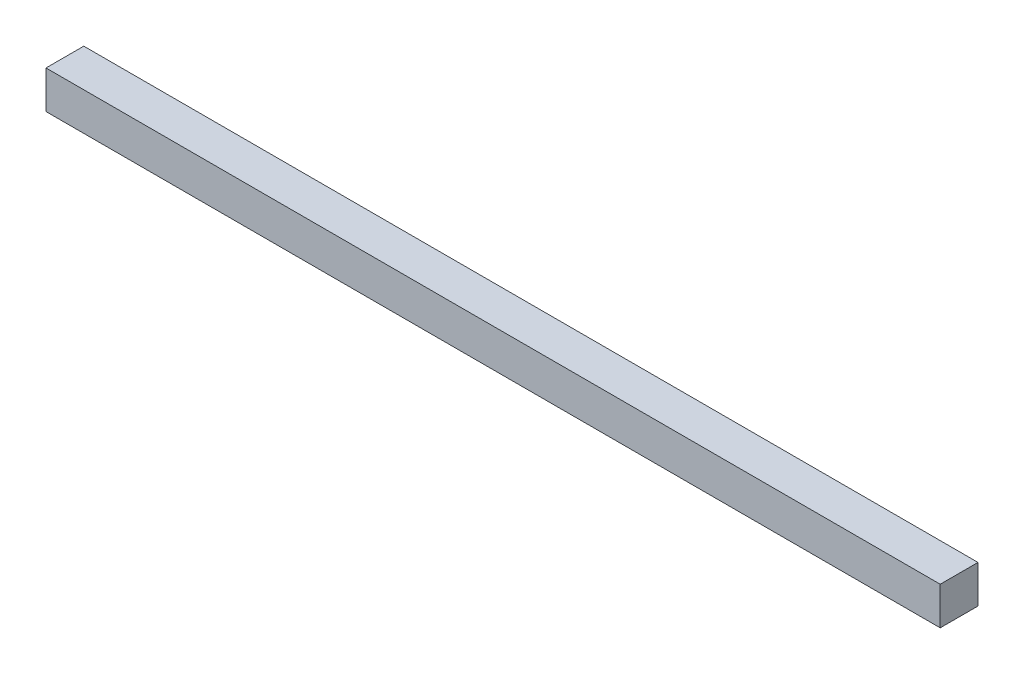
ISO-10303-21;
HEADER;
FILE_DESCRIPTION(('STEP AP214'),'2;1');
FILE_NAME('part.step','',(''),(''),'','','');
FILE_SCHEMA(('AUTOMOTIVE_DESIGN { 1 0 10303 214 1 1 1 1 }'));
ENDSEC;
DATA;
#1=APPLICATION_CONTEXT('core data for automotive mechanical design processes');
#2=APPLICATION_PROTOCOL_DEFINITION('international standard','automotive_design',2000,#1);
#3=PRODUCT_CONTEXT('',#1,'mechanical');
#4=PRODUCT('Part','Part','',(#3));
#5=PRODUCT_RELATED_PRODUCT_CATEGORY('part','',(#4));
#6=PRODUCT_DEFINITION_FORMATION('','',#4);
#7=PRODUCT_DEFINITION_CONTEXT('part definition',#1,'design');
#8=PRODUCT_DEFINITION('design','',#6,#7);
#9=PRODUCT_DEFINITION_SHAPE('','',#8);
#10=(LENGTH_UNIT() NAMED_UNIT(*) SI_UNIT(.MILLI.,.METRE.));
#11=(NAMED_UNIT(*) PLANE_ANGLE_UNIT() SI_UNIT($,.RADIAN.));
#12=(NAMED_UNIT(*) SI_UNIT($,.STERADIAN.) SOLID_ANGLE_UNIT());
#13=UNCERTAINTY_MEASURE_WITH_UNIT(LENGTH_MEASURE(1.E-05),#10,'distance_accuracy_value','');
#14=(GEOMETRIC_REPRESENTATION_CONTEXT(3) GLOBAL_UNCERTAINTY_ASSIGNED_CONTEXT((#13)) GLOBAL_UNIT_ASSIGNED_CONTEXT((#10,
#11,#12)) REPRESENTATION_CONTEXT('',''));
#15=CARTESIAN_POINT('',(0.,0.,0.));
#16=DIRECTION('',(0.,0.,1.));
#17=DIRECTION('',(1.,0.,0.));
#18=AXIS2_PLACEMENT_3D('',#15,#16,#17);
#19=CARTESIAN_POINT('',(0.,0.,6.));
#20=DIRECTION('',(1.,0.,0.));
#21=DIRECTION('',(0.,0.,-1.));
#22=AXIS2_PLACEMENT_3D('',#19,#20,#21);
#23=PLANE('',#22);
#24=DIRECTION('',(0.,-1.,0.));
#25=VECTOR('',#24,1.);
#26=CARTESIAN_POINT('',(0.,0.,0.));
#27=LINE('',#26,#25);
#28=CARTESIAN_POINT('',(0.,6.,0.));
#29=VERTEX_POINT('',#28);
#30=CARTESIAN_POINT('',(0.,0.,0.));
#31=VERTEX_POINT('',#30);
#32=EDGE_CURVE('E108',#29,#31,#27,.T.);
#33=ORIENTED_EDGE('',*,*,#32,.T.);
#34=DIRECTION('',(0.,0.,-1.));
#35=VECTOR('',#34,1.);
#36=CARTESIAN_POINT('',(0.,0.,6.));
#37=LINE('',#36,#35);
#38=CARTESIAN_POINT('',(0.,0.,6.));
#39=VERTEX_POINT('',#38);
#40=EDGE_CURVE('E11',#39,#31,#37,.T.);
#41=ORIENTED_EDGE('',*,*,#40,.F.);
#42=DIRECTION('',(0.,-1.,0.));
#43=VECTOR('',#42,1.);
#44=CARTESIAN_POINT('',(0.,0.,6.));
#45=LINE('',#44,#43);
#46=CARTESIAN_POINT('',(0.,6.,6.));
#47=VERTEX_POINT('',#46);
#48=EDGE_CURVE('E92',#47,#39,#45,.T.);
#49=ORIENTED_EDGE('',*,*,#48,.F.);
#50=DIRECTION('',(0.,0.,-1.));
#51=VECTOR('',#50,1.);
#52=CARTESIAN_POINT('',(0.,6.,6.));
#53=LINE('',#52,#51);
#54=EDGE_CURVE('E105',#47,#29,#53,.T.);
#55=ORIENTED_EDGE('',*,*,#54,.T.);
#56=EDGE_LOOP('',(#33,#41,#49,#55));
#57=FACE_BOUND('',#56,.T.);
#58=ADVANCED_FACE('F43',(#57),#23,.F.);
#59=CARTESIAN_POINT('',(0.,0.,6.));
#60=DIRECTION('',(0.,1.,0.));
#61=DIRECTION('',(0.,0.,1.));
#62=AXIS2_PLACEMENT_3D('',#59,#60,#61);
#63=PLANE('',#62);
#64=DIRECTION('',(1.,0.,0.));
#65=VECTOR('',#64,1.);
#66=CARTESIAN_POINT('',(0.,0.,0.));
#67=LINE('',#66,#65);
#68=CARTESIAN_POINT('',(142.,0.,0.));
#69=VERTEX_POINT('',#68);
#70=EDGE_CURVE('E97',#31,#69,#67,.T.);
#71=ORIENTED_EDGE('',*,*,#70,.T.);
#72=DIRECTION('',(0.,0.,-1.));
#73=VECTOR('',#72,1.);
#74=CARTESIAN_POINT('',(142.,0.,6.));
#75=LINE('',#74,#73);
#76=CARTESIAN_POINT('',(142.,0.,6.));
#77=VERTEX_POINT('',#76);
#78=EDGE_CURVE('E51',#77,#69,#75,.T.);
#79=ORIENTED_EDGE('',*,*,#78,.F.);
#80=DIRECTION('',(1.,0.,0.));
#81=VECTOR('',#80,1.);
#82=CARTESIAN_POINT('',(0.,0.,6.));
#83=LINE('',#82,#81);
#84=EDGE_CURVE('E87',#39,#77,#83,.T.);
#85=ORIENTED_EDGE('',*,*,#84,.F.);
#86=ORIENTED_EDGE('',*,*,#40,.T.);
#87=EDGE_LOOP('',(#71,#79,#85,#86));
#88=FACE_BOUND('',#87,.T.);
#89=ADVANCED_FACE('F100',(#88),#63,.F.);
#90=CARTESIAN_POINT('',(142.,0.,6.));
#91=DIRECTION('',(-1.,0.,0.));
#92=DIRECTION('',(0.,0.,1.));
#93=AXIS2_PLACEMENT_3D('',#90,#91,#92);
#94=PLANE('',#93);
#95=DIRECTION('',(0.,1.,0.));
#96=VECTOR('',#95,1.);
#97=CARTESIAN_POINT('',(142.,0.,0.));
#98=LINE('',#97,#96);
#99=CARTESIAN_POINT('',(142.,6.,0.));
#100=VERTEX_POINT('',#99);
#101=EDGE_CURVE('E78',#69,#100,#98,.T.);
#102=ORIENTED_EDGE('',*,*,#101,.T.);
#103=DIRECTION('',(0.,0.,-1.));
#104=VECTOR('',#103,1.);
#105=CARTESIAN_POINT('',(142.,6.,6.));
#106=LINE('',#105,#104);
#107=CARTESIAN_POINT('',(142.,6.,6.));
#108=VERTEX_POINT('',#107);
#109=EDGE_CURVE('E98',#108,#100,#106,.T.);
#110=ORIENTED_EDGE('',*,*,#109,.F.);
#111=DIRECTION('',(0.,1.,0.));
#112=VECTOR('',#111,1.);
#113=CARTESIAN_POINT('',(142.,0.,6.));
#114=LINE('',#113,#112);
#115=EDGE_CURVE('E95',#77,#108,#114,.T.);
#116=ORIENTED_EDGE('',*,*,#115,.F.);
#117=ORIENTED_EDGE('',*,*,#78,.T.);
#118=EDGE_LOOP('',(#102,#110,#116,#117));
#119=FACE_BOUND('',#118,.T.);
#120=ADVANCED_FACE('F99',(#119),#94,.F.);
#121=CARTESIAN_POINT('',(0.,6.,6.));
#122=DIRECTION('',(0.,-1.,0.));
#123=DIRECTION('',(0.,0.,-1.));
#124=AXIS2_PLACEMENT_3D('',#121,#122,#123);
#125=PLANE('',#124);
#126=DIRECTION('',(-1.,0.,0.));
#127=VECTOR('',#126,1.);
#128=CARTESIAN_POINT('',(0.,6.,0.));
#129=LINE('',#128,#127);
#130=EDGE_CURVE('E85',#100,#29,#129,.T.);
#131=ORIENTED_EDGE('',*,*,#130,.T.);
#132=ORIENTED_EDGE('',*,*,#54,.F.);
#133=DIRECTION('',(-1.,0.,0.));
#134=VECTOR('',#133,1.);
#135=CARTESIAN_POINT('',(0.,6.,6.));
#136=LINE('',#135,#134);
#137=EDGE_CURVE('E56',#108,#47,#136,.T.);
#138=ORIENTED_EDGE('',*,*,#137,.F.);
#139=ORIENTED_EDGE('',*,*,#109,.T.);
#140=EDGE_LOOP('',(#131,#132,#138,#139));
#141=FACE_BOUND('',#140,.T.);
#142=ADVANCED_FACE('F111',(#141),#125,.F.);
#143=CARTESIAN_POINT('',(0.,0.,6.));
#144=DIRECTION('',(0.,0.,-1.));
#145=DIRECTION('',(-1.,0.,0.));
#146=AXIS2_PLACEMENT_3D('',#143,#144,#145);
#147=PLANE('',#146);
#148=ORIENTED_EDGE('',*,*,#48,.T.);
#149=ORIENTED_EDGE('',*,*,#84,.T.);
#150=ORIENTED_EDGE('',*,*,#115,.T.);
#151=ORIENTED_EDGE('',*,*,#137,.T.);
#152=EDGE_LOOP('',(#148,#149,#150,#151));
#153=FACE_BOUND('',#152,.T.);
#154=ADVANCED_FACE('F89',(#153),#147,.F.);
#155=CARTESIAN_POINT('',(0.,0.,0.));
#156=DIRECTION('',(0.,0.,-1.));
#157=DIRECTION('',(-1.,0.,0.));
#158=AXIS2_PLACEMENT_3D('',#155,#156,#157);
#159=PLANE('',#158);
#160=ORIENTED_EDGE('',*,*,#32,.F.);
#161=ORIENTED_EDGE('',*,*,#130,.F.);
#162=ORIENTED_EDGE('',*,*,#101,.F.);
#163=ORIENTED_EDGE('',*,*,#70,.F.);
#164=EDGE_LOOP('',(#160,#161,#162,#163));
#165=FACE_BOUND('',#164,.T.);
#166=ADVANCED_FACE('F118',(#165),#159,.T.);
#167=CLOSED_SHELL('',(#58,#89,#120,#142,#154,#166));
#168=MANIFOLD_SOLID_BREP('B2',#167);
#169=ADVANCED_BREP_SHAPE_REPRESENTATION('',(#18,#168),#14);
#170=SHAPE_DEFINITION_REPRESENTATION(#9,#169);
ENDSEC;
END-ISO-10303-21;
